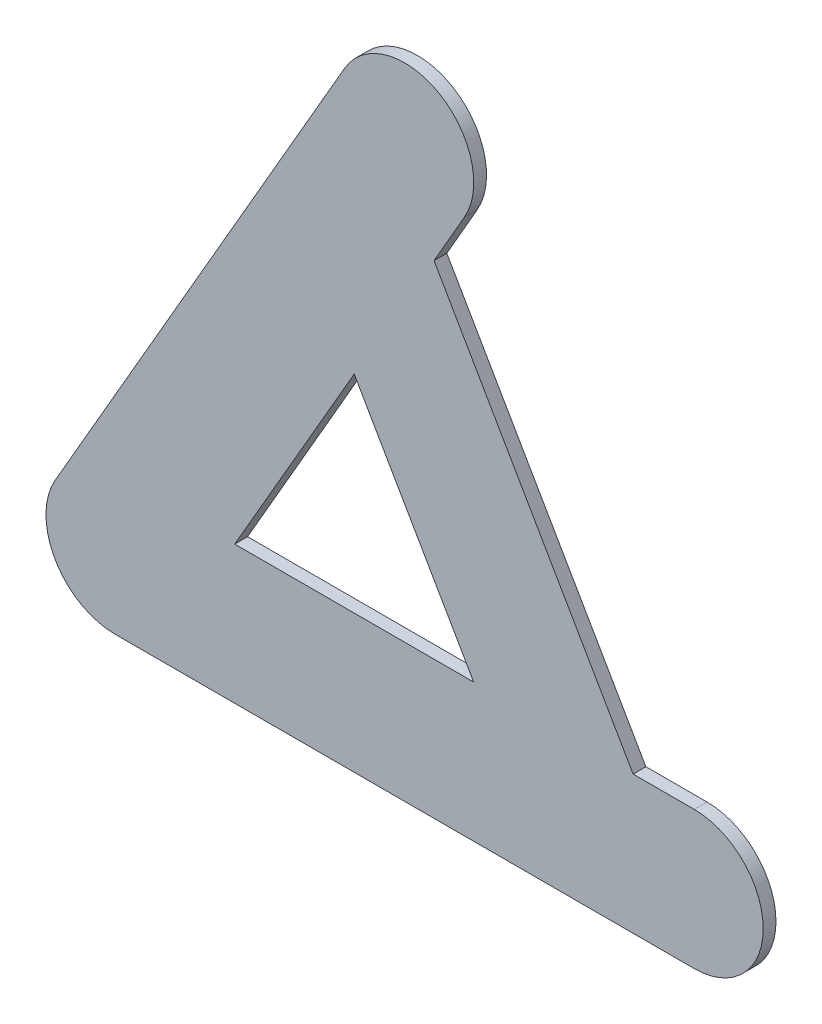
ISO-10303-21;
HEADER;
FILE_DESCRIPTION(('STEP AP214'),'2;1');
FILE_NAME('part.step','',(''),(''),'','','');
FILE_SCHEMA(('AUTOMOTIVE_DESIGN { 1 0 10303 214 1 1 1 1 }'));
ENDSEC;
DATA;
#1=APPLICATION_CONTEXT('core data for automotive mechanical design processes');
#2=APPLICATION_PROTOCOL_DEFINITION('international standard','automotive_design',2000,#1);
#3=PRODUCT_CONTEXT('',#1,'mechanical');
#4=PRODUCT('Part','Part','',(#3));
#5=PRODUCT_RELATED_PRODUCT_CATEGORY('part','',(#4));
#6=PRODUCT_DEFINITION_FORMATION('','',#4);
#7=PRODUCT_DEFINITION_CONTEXT('part definition',#1,'design');
#8=PRODUCT_DEFINITION('design','',#6,#7);
#9=PRODUCT_DEFINITION_SHAPE('','',#8);
#10=(LENGTH_UNIT() NAMED_UNIT(*) SI_UNIT(.MILLI.,.METRE.));
#11=(NAMED_UNIT(*) PLANE_ANGLE_UNIT() SI_UNIT($,.RADIAN.));
#12=(NAMED_UNIT(*) SI_UNIT($,.STERADIAN.) SOLID_ANGLE_UNIT());
#13=UNCERTAINTY_MEASURE_WITH_UNIT(LENGTH_MEASURE(1.E-05),#10,'distance_accuracy_value','');
#14=(GEOMETRIC_REPRESENTATION_CONTEXT(3) GLOBAL_UNCERTAINTY_ASSIGNED_CONTEXT((#13)) GLOBAL_UNIT_ASSIGNED_CONTEXT((#10,
#11,#12)) REPRESENTATION_CONTEXT('',''));
#15=CARTESIAN_POINT('',(0.,0.,0.));
#16=DIRECTION('',(0.,0.,1.));
#17=DIRECTION('',(1.,0.,0.));
#18=AXIS2_PLACEMENT_3D('',#15,#16,#17);
#19=CARTESIAN_POINT('',(0.,0.,0.));
#20=DIRECTION('',(0.,0.,1.));
#21=DIRECTION('',(1.,0.,0.));
#22=AXIS2_PLACEMENT_3D('',#19,#20,#21);
#23=PLANE('',#22);
#24=DIRECTION('',(1.,0.,0.));
#25=VECTOR('',#24,1.);
#26=CARTESIAN_POINT('',(-1.402,-1.349,0.));
#27=LINE('',#26,#25);
#28=CARTESIAN_POINT('',(-1.40199999999999,-1.349,0.));
#29=VERTEX_POINT('',#28);
#30=CARTESIAN_POINT('',(-2.336,-1.349,0.));
#31=VERTEX_POINT('',#30);
#32=EDGE_CURVE('E121',#29,#31,#27,.F.);
#33=ORIENTED_EDGE('',*,*,#32,.F.);
#34=DIRECTION('',(0.499938683107804,-0.866060802214507,0.));
#35=VECTOR('',#34,1.);
#36=CARTESIAN_POINT('',(-1.869,-0.54,0.));
#37=LINE('',#36,#35);
#38=CARTESIAN_POINT('',(-1.86899999999998,-0.54000000000001,0.));
#39=VERTEX_POINT('',#38);
#40=EDGE_CURVE('E156',#39,#29,#37,.T.);
#41=ORIENTED_EDGE('',*,*,#40,.F.);
#42=DIRECTION('',(0.499938683107804,0.866060802214507,0.));
#43=VECTOR('',#42,1.);
#44=CARTESIAN_POINT('',(-2.336,-1.349,0.));
#45=LINE('',#44,#43);
#46=EDGE_CURVE('E184',#31,#39,#45,.T.);
#47=ORIENTED_EDGE('',*,*,#46,.F.);
#48=EDGE_LOOP('',(#33,#41,#47));
#49=FACE_BOUND('',#48,.T.);
#50=DIRECTION('',(1.,0.,0.));
#51=VECTOR('',#50,1.);
#52=CARTESIAN_POINT('',(-0.54,-1.349,0.));
#53=LINE('',#52,#51);
#54=CARTESIAN_POINT('',(-0.54,-1.349,0.));
#55=VERTEX_POINT('',#54);
#56=CARTESIAN_POINT('',(-0.779,-1.349,0.));
#57=VERTEX_POINT('',#56);
#58=EDGE_CURVE('E135',#55,#57,#53,.F.);
#59=ORIENTED_EDGE('',*,*,#58,.F.);
#60=CARTESIAN_POINT('',(-0.54,-1.6185,0.));
#61=DIRECTION('',(0.,0.,1.));
#62=DIRECTION('',(1.,0.,0.));
#63=AXIS2_PLACEMENT_3D('',#60,#61,#62);
#64=CIRCLE('',#63,0.2695);
#65=CARTESIAN_POINT('',(-0.54,-1.888,0.));
#66=VERTEX_POINT('',#65);
#67=EDGE_CURVE('E157',#66,#55,#64,.T.);
#68=ORIENTED_EDGE('',*,*,#67,.F.);
#69=DIRECTION('',(1.,0.,0.));
#70=VECTOR('',#69,1.);
#71=CARTESIAN_POINT('',(-2.803,-1.888,0.));
#72=LINE('',#71,#70);
#73=CARTESIAN_POINT('',(-2.803,-1.88800000000019,0.));
#74=VERTEX_POINT('',#73);
#75=EDGE_CURVE('E140',#74,#66,#72,.T.);
#76=ORIENTED_EDGE('',*,*,#75,.F.);
#77=CARTESIAN_POINT('',(-2.803875136871,-1.618161280111,0.));
#78=DIRECTION('',(0.,0.,1.));
#79=DIRECTION('',(1.,0.,0.));
#80=AXIS2_PLACEMENT_3D('',#77,#78,#79);
#81=CIRCLE('',#80,0.269840139001);
#82=CARTESIAN_POINT('',(-3.03799999999989,-1.48400000000007,0.));
#83=VERTEX_POINT('',#82);
#84=EDGE_CURVE('E158',#83,#74,#81,.T.);
#85=ORIENTED_EDGE('',*,*,#84,.F.);
#86=DIRECTION('',(-0.499939092574703,-0.866060565847206,0.));
#87=VECTOR('',#86,1.);
#88=CARTESIAN_POINT('',(-1.906,0.477,0.));
#89=LINE('',#88,#87);
#90=CARTESIAN_POINT('',(-1.90600000000001,0.477000000000009,0.));
#91=VERTEX_POINT('',#90);
#92=EDGE_CURVE('E105',#91,#83,#89,.T.);
#93=ORIENTED_EDGE('',*,*,#92,.F.);
#94=CARTESIAN_POINT('',(-1.672,0.342,0.));
#95=DIRECTION('',(0.,0.,1.));
#96=DIRECTION('',(1.,0.,0.));
#97=AXIS2_PLACEMENT_3D('',#94,#95,#96);
#98=CIRCLE('',#97,0.2701499583565);
#99=CARTESIAN_POINT('',(-1.43799999999998,0.206999999999989,0.));
#100=VERTEX_POINT('',#99);
#101=EDGE_CURVE('E20',#100,#91,#98,.T.);
#102=ORIENTED_EDGE('',*,*,#101,.F.);
#103=DIRECTION('',(0.498392434149899,0.866951545117799,0.));
#104=VECTOR('',#103,1.);
#105=CARTESIAN_POINT('',(-1.557,0.,0.));
#106=LINE('',#105,#104);
#107=CARTESIAN_POINT('',(-1.55699999999999,0.,0.));
#108=VERTEX_POINT('',#107);
#109=EDGE_CURVE('E102',#108,#100,#106,.T.);
#110=ORIENTED_EDGE('',*,*,#109,.F.);
#111=DIRECTION('',(-0.499592735002601,0.866260410692201,0.));
#112=VECTOR('',#111,1.);
#113=CARTESIAN_POINT('',(-0.779,-1.349,0.));
#114=LINE('',#113,#112);
#115=EDGE_CURVE('E118',#57,#108,#114,.T.);
#116=ORIENTED_EDGE('',*,*,#115,.F.);
#117=EDGE_LOOP('',(#59,#68,#76,#85,#93,#102,#110,#116));
#118=FACE_BOUND('',#117,.T.);
#119=ADVANCED_FACE('F17',(#49,#118),#23,.F.);
#120=CARTESIAN_POINT('',(-1.672,0.342,0.));
#121=DIRECTION('',(0.,0.,1.));
#122=DIRECTION('',(1.,0.,0.));
#123=AXIS2_PLACEMENT_3D('',#120,#121,#122);
#124=CYLINDRICAL_SURFACE('',#123,0.2701499583565);
#125=DIRECTION('',(0.,0.,1.));
#126=VECTOR('',#125,1.);
#127=CARTESIAN_POINT('',(-1.43799999999999,0.206999999999994,0.));
#128=LINE('',#127,#126);
#129=CARTESIAN_POINT('',(-1.43799999999998,0.20699999999999,0.05));
#130=VERTEX_POINT('',#129);
#131=EDGE_CURVE('E110',#100,#130,#128,.T.);
#132=ORIENTED_EDGE('',*,*,#131,.F.);
#133=ORIENTED_EDGE('',*,*,#101,.T.);
#134=DIRECTION('',(0.,0.,1.));
#135=VECTOR('',#134,1.);
#136=CARTESIAN_POINT('',(-1.906,0.477,0.));
#137=LINE('',#136,#135);
#138=CARTESIAN_POINT('',(-1.906,0.477,0.05));
#139=VERTEX_POINT('',#138);
#140=EDGE_CURVE('E108',#139,#91,#137,.F.);
#141=ORIENTED_EDGE('',*,*,#140,.F.);
#142=CARTESIAN_POINT('',(-1.672,0.342,0.05));
#143=DIRECTION('',(0.,0.,1.));
#144=DIRECTION('',(1.,0.,0.));
#145=AXIS2_PLACEMENT_3D('',#142,#143,#144);
#146=CIRCLE('',#145,0.2701499583565);
#147=EDGE_CURVE('E113',#130,#139,#146,.T.);
#148=ORIENTED_EDGE('',*,*,#147,.F.);
#149=EDGE_LOOP('',(#132,#133,#141,#148));
#150=FACE_BOUND('',#149,.T.);
#151=ADVANCED_FACE('F111',(#150),#124,.T.);
#152=CARTESIAN_POINT('',(-1.906,0.477,0.));
#153=DIRECTION('',(-0.866060565847206,0.499939092574703,0.));
#154=DIRECTION('',(-0.499939092574703,-0.866060565847206,0.));
#155=AXIS2_PLACEMENT_3D('',#152,#153,#154);
#156=PLANE('',#155);
#157=ORIENTED_EDGE('',*,*,#140,.T.);
#158=ORIENTED_EDGE('',*,*,#92,.T.);
#159=DIRECTION('',(0.,0.,1.));
#160=VECTOR('',#159,1.);
#161=CARTESIAN_POINT('',(-3.03799999999981,-1.48400000000011,0.));
#162=LINE('',#161,#160);
#163=CARTESIAN_POINT('',(-3.03799999999986,-1.48400000000008,0.05));
#164=VERTEX_POINT('',#163);
#165=EDGE_CURVE('E145',#164,#83,#162,.F.);
#166=ORIENTED_EDGE('',*,*,#165,.F.);
#167=DIRECTION('',(-0.49993909257472,-0.866060565847196,0.));
#168=VECTOR('',#167,1.);
#169=CARTESIAN_POINT('',(-1.906,0.477,0.05));
#170=LINE('',#169,#168);
#171=EDGE_CURVE('E154',#139,#164,#170,.T.);
#172=ORIENTED_EDGE('',*,*,#171,.F.);
#173=EDGE_LOOP('',(#157,#158,#166,#172));
#174=FACE_BOUND('',#173,.T.);
#175=ADVANCED_FACE('F252',(#174),#156,.T.);
#176=CARTESIAN_POINT('',(-2.803875136871,-1.618161280111,0.));
#177=DIRECTION('',(0.,0.,1.));
#178=DIRECTION('',(1.,0.,0.));
#179=AXIS2_PLACEMENT_3D('',#176,#177,#178);
#180=CYLINDRICAL_SURFACE('',#179,0.269840139001);
#181=ORIENTED_EDGE('',*,*,#165,.T.);
#182=ORIENTED_EDGE('',*,*,#84,.T.);
#183=DIRECTION('',(0.,0.,-1.));
#184=VECTOR('',#183,1.);
#185=CARTESIAN_POINT('',(-2.803,-1.888,0.));
#186=LINE('',#185,#184);
#187=CARTESIAN_POINT('',(-2.803,-1.888,0.05));
#188=VERTEX_POINT('',#187);
#189=EDGE_CURVE('E143',#188,#74,#186,.T.);
#190=ORIENTED_EDGE('',*,*,#189,.F.);
#191=CARTESIAN_POINT('',(-2.803875136871,-1.618161280111,0.05));
#192=DIRECTION('',(0.,0.,1.));
#193=DIRECTION('',(1.,0.,0.));
#194=AXIS2_PLACEMENT_3D('',#191,#192,#193);
#195=CIRCLE('',#194,0.269840139001);
#196=EDGE_CURVE('E151',#164,#188,#195,.T.);
#197=ORIENTED_EDGE('',*,*,#196,.F.);
#198=EDGE_LOOP('',(#181,#182,#190,#197));
#199=FACE_BOUND('',#198,.T.);
#200=ADVANCED_FACE('F248',(#199),#180,.T.);
#201=CARTESIAN_POINT('',(-2.803,-1.888,0.));
#202=DIRECTION('',(0.,-1.,0.));
#203=DIRECTION('',(0.,0.,-1.));
#204=AXIS2_PLACEMENT_3D('',#201,#202,#203);
#205=PLANE('',#204);
#206=ORIENTED_EDGE('',*,*,#189,.T.);
#207=ORIENTED_EDGE('',*,*,#75,.T.);
#208=DIRECTION('',(0.,0.,1.));
#209=VECTOR('',#208,1.);
#210=CARTESIAN_POINT('',(-0.54,-1.888,0.));
#211=LINE('',#210,#209);
#212=CARTESIAN_POINT('',(-0.54,-1.888,0.05));
#213=VERTEX_POINT('',#212);
#214=EDGE_CURVE('E142',#213,#66,#211,.F.);
#215=ORIENTED_EDGE('',*,*,#214,.F.);
#216=DIRECTION('',(1.,0.,0.));
#217=VECTOR('',#216,1.);
#218=CARTESIAN_POINT('',(0.,-1.888,0.05));
#219=LINE('',#218,#217);
#220=EDGE_CURVE('E150',#188,#213,#219,.T.);
#221=ORIENTED_EDGE('',*,*,#220,.F.);
#222=EDGE_LOOP('',(#206,#207,#215,#221));
#223=FACE_BOUND('',#222,.T.);
#224=ADVANCED_FACE('F244',(#223),#205,.T.);
#225=CARTESIAN_POINT('',(-0.54,-1.6185,0.));
#226=DIRECTION('',(0.,0.,1.));
#227=DIRECTION('',(1.,0.,0.));
#228=AXIS2_PLACEMENT_3D('',#225,#226,#227);
#229=CYLINDRICAL_SURFACE('',#228,0.2695);
#230=ORIENTED_EDGE('',*,*,#214,.T.);
#231=ORIENTED_EDGE('',*,*,#67,.T.);
#232=DIRECTION('',(0.,0.,1.));
#233=VECTOR('',#232,1.);
#234=CARTESIAN_POINT('',(-0.54,-1.349,0.));
#235=LINE('',#234,#233);
#236=CARTESIAN_POINT('',(-0.54,-1.349,0.05));
#237=VERTEX_POINT('',#236);
#238=EDGE_CURVE('E137',#237,#55,#235,.F.);
#239=ORIENTED_EDGE('',*,*,#238,.F.);
#240=CARTESIAN_POINT('',(-0.54,-1.6185,0.05));
#241=DIRECTION('',(0.,0.,1.));
#242=DIRECTION('',(1.,0.,0.));
#243=AXIS2_PLACEMENT_3D('',#240,#241,#242);
#244=CIRCLE('',#243,0.2695);
#245=EDGE_CURVE('E146',#213,#237,#244,.T.);
#246=ORIENTED_EDGE('',*,*,#245,.F.);
#247=EDGE_LOOP('',(#230,#231,#239,#246));
#248=FACE_BOUND('',#247,.T.);
#249=ADVANCED_FACE('F240',(#248),#229,.T.);
#250=CARTESIAN_POINT('',(-0.54,-1.349,0.));
#251=DIRECTION('',(0.,1.,0.));
#252=DIRECTION('',(0.,0.,1.));
#253=AXIS2_PLACEMENT_3D('',#250,#251,#252);
#254=PLANE('',#253);
#255=ORIENTED_EDGE('',*,*,#238,.T.);
#256=ORIENTED_EDGE('',*,*,#58,.T.);
#257=DIRECTION('',(0.,0.,1.));
#258=VECTOR('',#257,1.);
#259=CARTESIAN_POINT('',(-0.779,-1.349,0.));
#260=LINE('',#259,#258);
#261=CARTESIAN_POINT('',(-0.779,-1.349,0.05));
#262=VERTEX_POINT('',#261);
#263=EDGE_CURVE('E132',#262,#57,#260,.F.);
#264=ORIENTED_EDGE('',*,*,#263,.F.);
#265=DIRECTION('',(1.,0.,0.));
#266=VECTOR('',#265,1.);
#267=CARTESIAN_POINT('',(0.,-1.349,0.05));
#268=LINE('',#267,#266);
#269=EDGE_CURVE('E149',#237,#262,#268,.F.);
#270=ORIENTED_EDGE('',*,*,#269,.F.);
#271=EDGE_LOOP('',(#255,#256,#264,#270));
#272=FACE_BOUND('',#271,.T.);
#273=ADVANCED_FACE('F236',(#272),#254,.T.);
#274=CARTESIAN_POINT('',(-0.779,-1.349,0.));
#275=DIRECTION('',(0.866260410692201,0.499592735002601,0.));
#276=DIRECTION('',(-0.499592735002601,0.866260410692201,0.));
#277=AXIS2_PLACEMENT_3D('',#274,#275,#276);
#278=PLANE('',#277);
#279=ORIENTED_EDGE('',*,*,#263,.T.);
#280=ORIENTED_EDGE('',*,*,#115,.T.);
#281=DIRECTION('',(0.,0.,1.));
#282=VECTOR('',#281,1.);
#283=CARTESIAN_POINT('',(-1.557,0.,0.));
#284=LINE('',#283,#282);
#285=CARTESIAN_POINT('',(-1.557,0.,0.05));
#286=VERTEX_POINT('',#285);
#287=EDGE_CURVE('E117',#286,#108,#284,.F.);
#288=ORIENTED_EDGE('',*,*,#287,.F.);
#289=DIRECTION('',(-0.499592735002614,0.866260410692194,0.));
#290=VECTOR('',#289,1.);
#291=CARTESIAN_POINT('',(-0.779,-1.349,0.05));
#292=LINE('',#291,#290);
#293=EDGE_CURVE('E176',#262,#286,#292,.T.);
#294=ORIENTED_EDGE('',*,*,#293,.F.);
#295=EDGE_LOOP('',(#279,#280,#288,#294));
#296=FACE_BOUND('',#295,.T.);
#297=ADVANCED_FACE('F233',(#296),#278,.T.);
#298=CARTESIAN_POINT('',(-1.557,0.,0.));
#299=DIRECTION('',(0.866951545117799,-0.498392434149899,0.));
#300=DIRECTION('',(0.498392434149899,0.866951545117799,0.));
#301=AXIS2_PLACEMENT_3D('',#298,#299,#300);
#302=PLANE('',#301);
#303=ORIENTED_EDGE('',*,*,#287,.T.);
#304=ORIENTED_EDGE('',*,*,#109,.T.);
#305=ORIENTED_EDGE('',*,*,#131,.T.);
#306=DIRECTION('',(0.498392434149859,0.866951545117822,0.));
#307=VECTOR('',#306,1.);
#308=CARTESIAN_POINT('',(-1.557,0.,0.05));
#309=LINE('',#308,#307);
#310=EDGE_CURVE('E179',#286,#130,#309,.T.);
#311=ORIENTED_EDGE('',*,*,#310,.F.);
#312=EDGE_LOOP('',(#303,#304,#305,#311));
#313=FACE_BOUND('',#312,.T.);
#314=ADVANCED_FACE('F120',(#313),#302,.T.);
#315=CARTESIAN_POINT('',(-1.402,-1.349,0.));
#316=DIRECTION('',(0.,1.,0.));
#317=DIRECTION('',(0.,0.,1.));
#318=AXIS2_PLACEMENT_3D('',#315,#316,#317);
#319=PLANE('',#318);
#320=DIRECTION('',(0.,0.,1.));
#321=VECTOR('',#320,1.);
#322=CARTESIAN_POINT('',(-1.40199999999997,-1.34899999999998,0.));
#323=LINE('',#322,#321);
#324=CARTESIAN_POINT('',(-1.40199999999999,-1.349,0.05));
#325=VERTEX_POINT('',#324);
#326=EDGE_CURVE('E186',#29,#325,#323,.T.);
#327=ORIENTED_EDGE('',*,*,#326,.F.);
#328=ORIENTED_EDGE('',*,*,#32,.T.);
#329=DIRECTION('',(0.,0.,1.));
#330=VECTOR('',#329,1.);
#331=CARTESIAN_POINT('',(-2.336,-1.349,0.));
#332=LINE('',#331,#330);
#333=CARTESIAN_POINT('',(-2.336,-1.349,0.05));
#334=VERTEX_POINT('',#333);
#335=EDGE_CURVE('E123',#334,#31,#332,.F.);
#336=ORIENTED_EDGE('',*,*,#335,.F.);
#337=DIRECTION('',(1.,0.,0.));
#338=VECTOR('',#337,1.);
#339=CARTESIAN_POINT('',(0.,-1.349,0.05));
#340=LINE('',#339,#338);
#341=EDGE_CURVE('E203',#325,#334,#340,.F.);
#342=ORIENTED_EDGE('',*,*,#341,.F.);
#343=EDGE_LOOP('',(#327,#328,#336,#342));
#344=FACE_BOUND('',#343,.T.);
#345=ADVANCED_FACE('F215',(#344),#319,.T.);
#346=CARTESIAN_POINT('',(-2.336,-1.349,0.));
#347=DIRECTION('',(0.866060802214507,-0.499938683107804,0.));
#348=DIRECTION('',(0.499938683107804,0.866060802214507,0.));
#349=AXIS2_PLACEMENT_3D('',#346,#347,#348);
#350=PLANE('',#349);
#351=ORIENTED_EDGE('',*,*,#335,.T.);
#352=ORIENTED_EDGE('',*,*,#46,.T.);
#353=DIRECTION('',(0.,0.,1.));
#354=VECTOR('',#353,1.);
#355=CARTESIAN_POINT('',(-1.869,-0.54,0.));
#356=LINE('',#355,#354);
#357=CARTESIAN_POINT('',(-1.86899999999998,-0.54000000000001,0.05));
#358=VERTEX_POINT('',#357);
#359=EDGE_CURVE('E35',#358,#39,#356,.F.);
#360=ORIENTED_EDGE('',*,*,#359,.F.);
#361=DIRECTION('',(0.499938683107768,0.866060802214527,0.));
#362=VECTOR('',#361,1.);
#363=CARTESIAN_POINT('',(-2.336,-1.349,0.05));
#364=LINE('',#363,#362);
#365=EDGE_CURVE('E26',#334,#358,#364,.T.);
#366=ORIENTED_EDGE('',*,*,#365,.F.);
#367=EDGE_LOOP('',(#351,#352,#360,#366));
#368=FACE_BOUND('',#367,.T.);
#369=ADVANCED_FACE('F210',(#368),#350,.T.);
#370=CARTESIAN_POINT('',(-1.869,-0.54,0.));
#371=DIRECTION('',(-0.866060802214507,-0.499938683107804,0.));
#372=DIRECTION('',(0.499938683107804,-0.866060802214507,0.));
#373=AXIS2_PLACEMENT_3D('',#370,#371,#372);
#374=PLANE('',#373);
#375=ORIENTED_EDGE('',*,*,#359,.T.);
#376=ORIENTED_EDGE('',*,*,#40,.T.);
#377=ORIENTED_EDGE('',*,*,#326,.T.);
#378=DIRECTION('',(0.499938683107768,-0.866060802214527,0.));
#379=VECTOR('',#378,1.);
#380=CARTESIAN_POINT('',(-1.869,-0.54,0.05));
#381=LINE('',#380,#379);
#382=EDGE_CURVE('E11',#358,#325,#381,.T.);
#383=ORIENTED_EDGE('',*,*,#382,.F.);
#384=EDGE_LOOP('',(#375,#376,#377,#383));
#385=FACE_BOUND('',#384,.T.);
#386=ADVANCED_FACE('F218',(#385),#374,.T.);
#387=CARTESIAN_POINT('',(0.,0.,0.05));
#388=DIRECTION('',(0.,0.,1.));
#389=DIRECTION('',(1.,0.,0.));
#390=AXIS2_PLACEMENT_3D('',#387,#388,#389);
#391=PLANE('',#390);
#392=ORIENTED_EDGE('',*,*,#365,.T.);
#393=ORIENTED_EDGE('',*,*,#382,.T.);
#394=ORIENTED_EDGE('',*,*,#341,.T.);
#395=EDGE_LOOP('',(#392,#393,#394));
#396=FACE_BOUND('',#395,.T.);
#397=ORIENTED_EDGE('',*,*,#293,.T.);
#398=ORIENTED_EDGE('',*,*,#310,.T.);
#399=ORIENTED_EDGE('',*,*,#147,.T.);
#400=ORIENTED_EDGE('',*,*,#171,.T.);
#401=ORIENTED_EDGE('',*,*,#196,.T.);
#402=ORIENTED_EDGE('',*,*,#220,.T.);
#403=ORIENTED_EDGE('',*,*,#245,.T.);
#404=ORIENTED_EDGE('',*,*,#269,.T.);
#405=EDGE_LOOP('',(#397,#398,#399,#400,#401,#402,#403,#404));
#406=FACE_BOUND('',#405,.T.);
#407=ADVANCED_FACE('F208',(#396,#406),#391,.T.);
#408=CLOSED_SHELL('',(#119,#151,#175,#200,#224,#249,#273,#297,#314,#345,#369,#386,#407));
#409=MANIFOLD_SOLID_BREP('B1',#408);
#410=ADVANCED_BREP_SHAPE_REPRESENTATION('',(#18,#409),#14);
#411=SHAPE_DEFINITION_REPRESENTATION(#9,#410);
ENDSEC;
END-ISO-10303-21;
